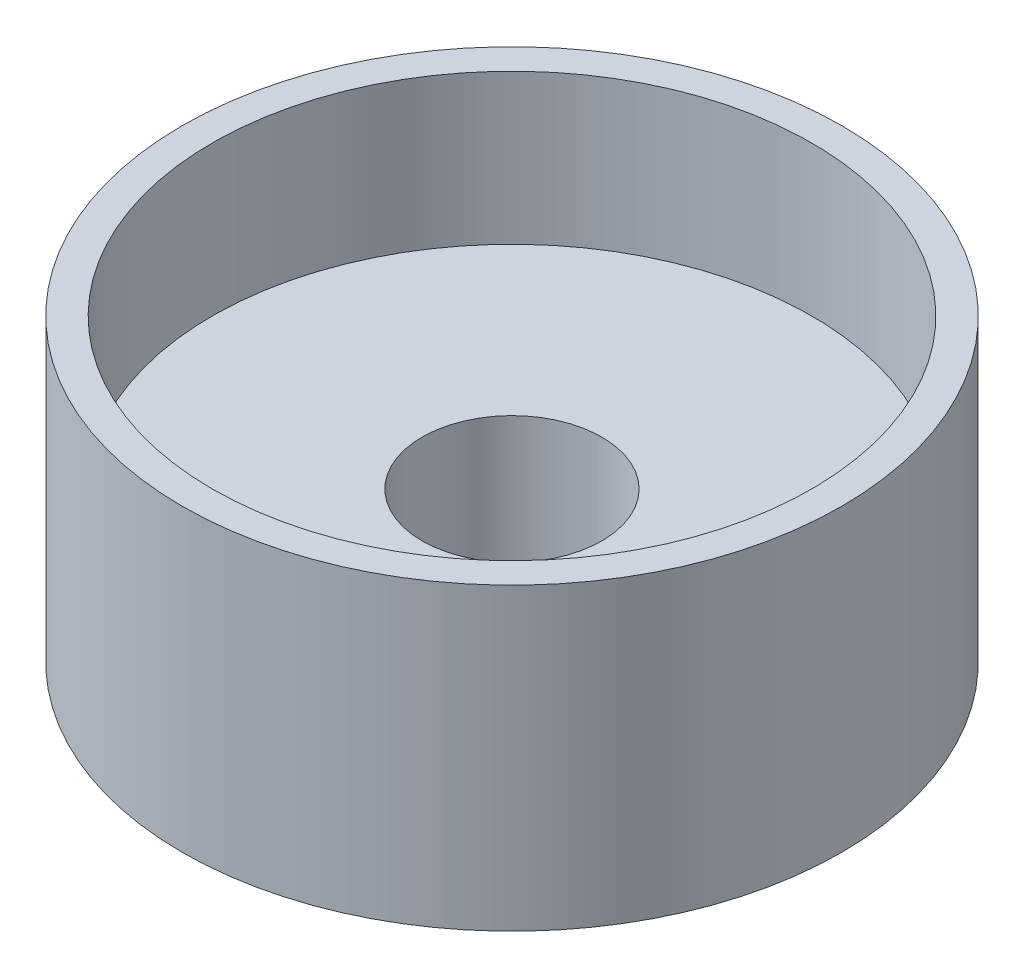
ISO-10303-21;
HEADER;
FILE_DESCRIPTION(('STEP AP214'),'2;1');
FILE_NAME('part.step','',(''),(''),'','','');
FILE_SCHEMA(('AUTOMOTIVE_DESIGN { 1 0 10303 214 1 1 1 1 }'));
ENDSEC;
DATA;
#1=APPLICATION_CONTEXT('core data for automotive mechanical design processes');
#2=APPLICATION_PROTOCOL_DEFINITION('international standard','automotive_design',2000,#1);
#3=PRODUCT_CONTEXT('',#1,'mechanical');
#4=PRODUCT('Part','Part','',(#3));
#5=PRODUCT_RELATED_PRODUCT_CATEGORY('part','',(#4));
#6=PRODUCT_DEFINITION_FORMATION('','',#4);
#7=PRODUCT_DEFINITION_CONTEXT('part definition',#1,'design');
#8=PRODUCT_DEFINITION('design','',#6,#7);
#9=PRODUCT_DEFINITION_SHAPE('','',#8);
#10=(LENGTH_UNIT() NAMED_UNIT(*) SI_UNIT(.MILLI.,.METRE.));
#11=(NAMED_UNIT(*) PLANE_ANGLE_UNIT() SI_UNIT($,.RADIAN.));
#12=(NAMED_UNIT(*) SI_UNIT($,.STERADIAN.) SOLID_ANGLE_UNIT());
#13=UNCERTAINTY_MEASURE_WITH_UNIT(LENGTH_MEASURE(1.E-05),#10,'distance_accuracy_value','');
#14=(GEOMETRIC_REPRESENTATION_CONTEXT(3) GLOBAL_UNCERTAINTY_ASSIGNED_CONTEXT((#13)) GLOBAL_UNIT_ASSIGNED_CONTEXT((#10,
#11,#12)) REPRESENTATION_CONTEXT('',''));
#15=CARTESIAN_POINT('',(0.,0.,0.));
#16=DIRECTION('',(0.,0.,1.));
#17=DIRECTION('',(1.,0.,0.));
#18=AXIS2_PLACEMENT_3D('',#15,#16,#17);
#19=CARTESIAN_POINT('',(0.,20.,0.));
#20=DIRECTION('',(0.,-1.,0.));
#21=DIRECTION('',(0.,0.,-1.));
#22=AXIS2_PLACEMENT_3D('',#19,#20,#21);
#23=CYLINDRICAL_SURFACE('',#22,3.);
#24=CARTESIAN_POINT('',(0.,0.,0.));
#25=DIRECTION('',(0.,1.,0.));
#26=DIRECTION('',(0.,0.,1.));
#27=AXIS2_PLACEMENT_3D('',#24,#25,#26);
#28=CIRCLE('',#27,3.);
#29=CARTESIAN_POINT('',(0.,0.,3.));
#30=VERTEX_POINT('',#29);
#31=EDGE_CURVE('E52',#30,#30,#28,.T.);
#32=ORIENTED_EDGE('',*,*,#31,.F.);
#33=EDGE_LOOP('',(#32));
#34=FACE_BOUND('',#33,.T.);
#35=CARTESIAN_POINT('',(0.,5.,0.));
#36=DIRECTION('',(0.,1.,0.));
#37=DIRECTION('',(0.,0.,1.));
#38=AXIS2_PLACEMENT_3D('',#35,#36,#37);
#39=CIRCLE('',#38,3.);
#40=CARTESIAN_POINT('',(0.,5.,3.));
#41=VERTEX_POINT('',#40);
#42=EDGE_CURVE('E41',#41,#41,#39,.T.);
#43=ORIENTED_EDGE('',*,*,#42,.T.);
#44=EDGE_LOOP('',(#43));
#45=FACE_BOUND('',#44,.T.);
#46=ADVANCED_FACE('F37',(#34,#45),#23,.F.);
#47=CARTESIAN_POINT('',(0.,10.,0.));
#48=DIRECTION('',(0.,-1.,0.));
#49=DIRECTION('',(0.,0.,-1.));
#50=AXIS2_PLACEMENT_3D('',#47,#48,#49);
#51=CYLINDRICAL_SURFACE('',#50,11.);
#52=CARTESIAN_POINT('',(0.,10.,0.));
#53=DIRECTION('',(0.,1.,0.));
#54=DIRECTION('',(0.,0.,1.));
#55=AXIS2_PLACEMENT_3D('',#52,#53,#54);
#56=CIRCLE('',#55,11.);
#57=CARTESIAN_POINT('',(0.,10.,11.));
#58=VERTEX_POINT('',#57);
#59=EDGE_CURVE('E10',#58,#58,#56,.T.);
#60=ORIENTED_EDGE('',*,*,#59,.F.);
#61=EDGE_LOOP('',(#60));
#62=FACE_BOUND('',#61,.T.);
#63=CARTESIAN_POINT('',(0.,0.,0.));
#64=DIRECTION('',(0.,1.,0.));
#65=DIRECTION('',(0.,0.,1.));
#66=AXIS2_PLACEMENT_3D('',#63,#64,#65);
#67=CIRCLE('',#66,11.);
#68=CARTESIAN_POINT('',(0.,0.,11.));
#69=VERTEX_POINT('',#68);
#70=EDGE_CURVE('E46',#69,#69,#67,.T.);
#71=ORIENTED_EDGE('',*,*,#70,.T.);
#72=EDGE_LOOP('',(#71));
#73=FACE_BOUND('',#72,.T.);
#74=ADVANCED_FACE('F39',(#62,#73),#51,.T.);
#75=CARTESIAN_POINT('',(0.,10.,0.));
#76=DIRECTION('',(0.,1.,0.));
#77=DIRECTION('',(0.,0.,1.));
#78=AXIS2_PLACEMENT_3D('',#75,#76,#77);
#79=PLANE('',#78);
#80=CARTESIAN_POINT('',(0.,10.,0.));
#81=DIRECTION('',(0.,1.,0.));
#82=DIRECTION('',(0.,0.,1.));
#83=AXIS2_PLACEMENT_3D('',#80,#81,#82);
#84=CIRCLE('',#83,10.);
#85=CARTESIAN_POINT('',(0.,10.,10.));
#86=VERTEX_POINT('',#85);
#87=EDGE_CURVE('E57',#86,#86,#84,.T.);
#88=ORIENTED_EDGE('',*,*,#87,.F.);
#89=EDGE_LOOP('',(#88));
#90=FACE_BOUND('',#89,.T.);
#91=ORIENTED_EDGE('',*,*,#59,.T.);
#92=EDGE_LOOP('',(#91));
#93=FACE_BOUND('',#92,.T.);
#94=ADVANCED_FACE('F87',(#90,#93),#79,.T.);
#95=CARTESIAN_POINT('',(0.,0.,0.));
#96=DIRECTION('',(0.,1.,0.));
#97=DIRECTION('',(0.,0.,1.));
#98=AXIS2_PLACEMENT_3D('',#95,#96,#97);
#99=PLANE('',#98);
#100=ORIENTED_EDGE('',*,*,#31,.T.);
#101=EDGE_LOOP('',(#100));
#102=FACE_BOUND('',#101,.T.);
#103=ORIENTED_EDGE('',*,*,#70,.F.);
#104=EDGE_LOOP('',(#103));
#105=FACE_BOUND('',#104,.T.);
#106=ADVANCED_FACE('F78',(#102,#105),#99,.F.);
#107=CARTESIAN_POINT('',(0.,5.,0.));
#108=DIRECTION('',(0.,1.,0.));
#109=DIRECTION('',(0.,0.,1.));
#110=AXIS2_PLACEMENT_3D('',#107,#108,#109);
#111=CYLINDRICAL_SURFACE('',#110,10.);
#112=CARTESIAN_POINT('',(0.,5.,0.));
#113=DIRECTION('',(0.,1.,0.));
#114=DIRECTION('',(0.,0.,1.));
#115=AXIS2_PLACEMENT_3D('',#112,#113,#114);
#116=CIRCLE('',#115,10.);
#117=CARTESIAN_POINT('',(0.,5.,10.));
#118=VERTEX_POINT('',#117);
#119=EDGE_CURVE('E61',#118,#118,#116,.T.);
#120=ORIENTED_EDGE('',*,*,#119,.F.);
#121=EDGE_LOOP('',(#120));
#122=FACE_BOUND('',#121,.T.);
#123=ORIENTED_EDGE('',*,*,#87,.T.);
#124=EDGE_LOOP('',(#123));
#125=FACE_BOUND('',#124,.T.);
#126=ADVANCED_FACE('F73',(#122,#125),#111,.F.);
#127=CARTESIAN_POINT('',(0.,5.,0.));
#128=DIRECTION('',(0.,1.,0.));
#129=DIRECTION('',(0.,0.,1.));
#130=AXIS2_PLACEMENT_3D('',#127,#128,#129);
#131=PLANE('',#130);
#132=ORIENTED_EDGE('',*,*,#42,.F.);
#133=EDGE_LOOP('',(#132));
#134=FACE_BOUND('',#133,.T.);
#135=ORIENTED_EDGE('',*,*,#119,.T.);
#136=EDGE_LOOP('',(#135));
#137=FACE_BOUND('',#136,.T.);
#138=ADVANCED_FACE('F71',(#134,#137),#131,.T.);
#139=CLOSED_SHELL('',(#46,#74,#94,#106,#126,#138));
#140=MANIFOLD_SOLID_BREP('B2',#139);
#141=ADVANCED_BREP_SHAPE_REPRESENTATION('',(#18,#140),#14);
#142=SHAPE_DEFINITION_REPRESENTATION(#9,#141);
ENDSEC;
END-ISO-10303-21;
